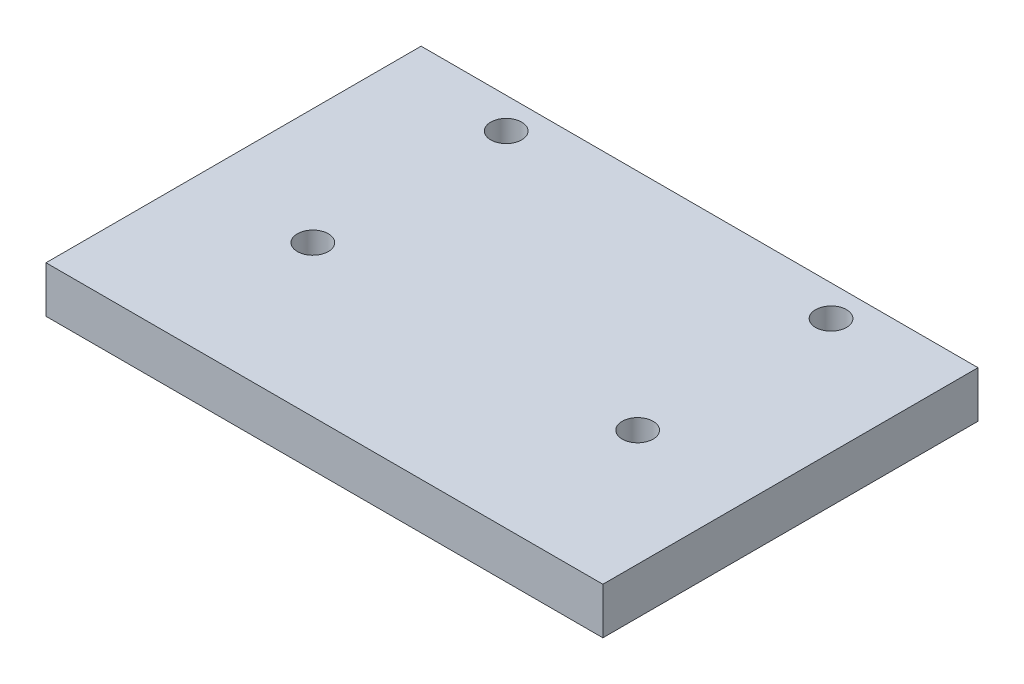
ISO-10303-21;
HEADER;
FILE_DESCRIPTION(('STEP AP214'),'2;1');
FILE_NAME('part.step','',(''),(''),'','','');
FILE_SCHEMA(('AUTOMOTIVE_DESIGN { 1 0 10303 214 1 1 1 1 }'));
ENDSEC;
DATA;
#1=APPLICATION_CONTEXT('core data for automotive mechanical design processes');
#2=APPLICATION_PROTOCOL_DEFINITION('international standard','automotive_design',2000,#1);
#3=PRODUCT_CONTEXT('',#1,'mechanical');
#4=PRODUCT('Part','Part','',(#3));
#5=PRODUCT_RELATED_PRODUCT_CATEGORY('part','',(#4));
#6=PRODUCT_DEFINITION_FORMATION('','',#4);
#7=PRODUCT_DEFINITION_CONTEXT('part definition',#1,'design');
#8=PRODUCT_DEFINITION('design','',#6,#7);
#9=PRODUCT_DEFINITION_SHAPE('','',#8);
#10=(LENGTH_UNIT() NAMED_UNIT(*) SI_UNIT(.MILLI.,.METRE.));
#11=(NAMED_UNIT(*) PLANE_ANGLE_UNIT() SI_UNIT($,.RADIAN.));
#12=(NAMED_UNIT(*) SI_UNIT($,.STERADIAN.) SOLID_ANGLE_UNIT());
#13=UNCERTAINTY_MEASURE_WITH_UNIT(LENGTH_MEASURE(1.E-05),#10,'distance_accuracy_value','');
#14=(GEOMETRIC_REPRESENTATION_CONTEXT(3) GLOBAL_UNCERTAINTY_ASSIGNED_CONTEXT((#13)) GLOBAL_UNIT_ASSIGNED_CONTEXT((#10,
#11,#12)) REPRESENTATION_CONTEXT('',''));
#15=CARTESIAN_POINT('',(0.,0.,0.));
#16=DIRECTION('',(0.,0.,1.));
#17=DIRECTION('',(1.,0.,0.));
#18=AXIS2_PLACEMENT_3D('',#15,#16,#17);
#19=CARTESIAN_POINT('',(0.,3.,0.));
#20=DIRECTION('',(0.,-1.,0.));
#21=DIRECTION('',(0.,0.,-1.));
#22=AXIS2_PLACEMENT_3D('',#19,#20,#21);
#23=PLANE('',#22);
#24=DIRECTION('',(1.,0.,0.));
#25=VECTOR('',#24,1.);
#26=CARTESIAN_POINT('',(36.,3.,0.));
#27=LINE('',#26,#25);
#28=CARTESIAN_POINT('',(0.,3.,0.));
#29=VERTEX_POINT('',#28);
#30=CARTESIAN_POINT('',(36.,3.,0.));
#31=VERTEX_POINT('',#30);
#32=EDGE_CURVE('E85',#29,#31,#27,.T.);
#33=ORIENTED_EDGE('',*,*,#32,.T.);
#34=DIRECTION('',(0.,0.,-1.));
#35=VECTOR('',#34,1.);
#36=CARTESIAN_POINT('',(36.,3.,-24.25));
#37=LINE('',#36,#35);
#38=CARTESIAN_POINT('',(36.,3.,-24.25));
#39=VERTEX_POINT('',#38);
#40=EDGE_CURVE('E80',#31,#39,#37,.T.);
#41=ORIENTED_EDGE('',*,*,#40,.T.);
#42=DIRECTION('',(-1.,0.,0.));
#43=VECTOR('',#42,1.);
#44=CARTESIAN_POINT('',(0.,3.,-24.25));
#45=LINE('',#44,#43);
#46=CARTESIAN_POINT('',(0.,3.,-24.25));
#47=VERTEX_POINT('',#46);
#48=EDGE_CURVE('E83',#39,#47,#45,.T.);
#49=ORIENTED_EDGE('',*,*,#48,.T.);
#50=DIRECTION('',(0.,0.,1.));
#51=VECTOR('',#50,1.);
#52=CARTESIAN_POINT('',(0.,3.,0.));
#53=LINE('',#52,#51);
#54=EDGE_CURVE('E50',#47,#29,#53,.T.);
#55=ORIENTED_EDGE('',*,*,#54,.T.);
#56=EDGE_LOOP('',(#33,#41,#49,#55));
#57=FACE_BOUND('',#56,.T.);
#58=CARTESIAN_POINT('',(7.5,3.,-22.25));
#59=DIRECTION('',(0.,1.,0.));
#60=DIRECTION('',(0.,0.,1.));
#61=AXIS2_PLACEMENT_3D('',#58,#59,#60);
#62=CIRCLE('',#61,1.);
#63=CARTESIAN_POINT('',(7.5,3.,-21.25));
#64=VERTEX_POINT('',#63);
#65=EDGE_CURVE('E100',#64,#64,#62,.T.);
#66=ORIENTED_EDGE('',*,*,#65,.F.);
#67=EDGE_LOOP('',(#66));
#68=FACE_BOUND('',#67,.T.);
#69=CARTESIAN_POINT('',(28.5,3.,-22.25));
#70=DIRECTION('',(0.,1.,0.));
#71=DIRECTION('',(0.,0.,1.));
#72=AXIS2_PLACEMENT_3D('',#69,#70,#71);
#73=CIRCLE('',#72,1.);
#74=CARTESIAN_POINT('',(28.5,3.,-21.25));
#75=VERTEX_POINT('',#74);
#76=EDGE_CURVE('E115',#75,#75,#73,.T.);
#77=ORIENTED_EDGE('',*,*,#76,.F.);
#78=EDGE_LOOP('',(#77));
#79=FACE_BOUND('',#78,.T.);
#80=CARTESIAN_POINT('',(28.5,3.,-9.75));
#81=DIRECTION('',(0.,1.,0.));
#82=DIRECTION('',(0.,0.,1.));
#83=AXIS2_PLACEMENT_3D('',#80,#81,#82);
#84=CIRCLE('',#83,1.);
#85=CARTESIAN_POINT('',(28.5,3.,-8.75));
#86=VERTEX_POINT('',#85);
#87=EDGE_CURVE('E121',#86,#86,#84,.T.);
#88=ORIENTED_EDGE('',*,*,#87,.F.);
#89=EDGE_LOOP('',(#88));
#90=FACE_BOUND('',#89,.T.);
#91=CARTESIAN_POINT('',(7.5,3.,-9.75));
#92=DIRECTION('',(0.,1.,0.));
#93=DIRECTION('',(0.,0.,1.));
#94=AXIS2_PLACEMENT_3D('',#91,#92,#93);
#95=CIRCLE('',#94,1.);
#96=CARTESIAN_POINT('',(7.5,3.,-8.75));
#97=VERTEX_POINT('',#96);
#98=EDGE_CURVE('E127',#97,#97,#95,.T.);
#99=ORIENTED_EDGE('',*,*,#98,.F.);
#100=EDGE_LOOP('',(#99));
#101=FACE_BOUND('',#100,.T.);
#102=ADVANCED_FACE('F33',(#57,#68,#79,#90,#101),#23,.F.);
#103=CARTESIAN_POINT('',(0.,0.,0.));
#104=DIRECTION('',(0.,-1.,0.));
#105=DIRECTION('',(0.,0.,-1.));
#106=AXIS2_PLACEMENT_3D('',#103,#104,#105);
#107=PLANE('',#106);
#108=CARTESIAN_POINT('',(28.5,0.,-9.75));
#109=DIRECTION('',(0.,1.,0.));
#110=DIRECTION('',(0.,0.,1.));
#111=AXIS2_PLACEMENT_3D('',#108,#109,#110);
#112=CIRCLE('',#111,1.);
#113=CARTESIAN_POINT('',(28.5,0.,-8.75));
#114=VERTEX_POINT('',#113);
#115=EDGE_CURVE('E124',#114,#114,#112,.T.);
#116=ORIENTED_EDGE('',*,*,#115,.T.);
#117=EDGE_LOOP('',(#116));
#118=FACE_BOUND('',#117,.T.);
#119=CARTESIAN_POINT('',(7.5,0.,-22.25));
#120=DIRECTION('',(0.,1.,0.));
#121=DIRECTION('',(0.,0.,1.));
#122=AXIS2_PLACEMENT_3D('',#119,#120,#121);
#123=CIRCLE('',#122,1.);
#124=CARTESIAN_POINT('',(7.5,0.,-21.25));
#125=VERTEX_POINT('',#124);
#126=EDGE_CURVE('E112',#125,#125,#123,.T.);
#127=ORIENTED_EDGE('',*,*,#126,.T.);
#128=EDGE_LOOP('',(#127));
#129=FACE_BOUND('',#128,.T.);
#130=DIRECTION('',(1.,0.,0.));
#131=VECTOR('',#130,1.);
#132=CARTESIAN_POINT('',(36.,0.,0.));
#133=LINE('',#132,#131);
#134=CARTESIAN_POINT('',(0.,0.,0.));
#135=VERTEX_POINT('',#134);
#136=CARTESIAN_POINT('',(36.,0.,0.));
#137=VERTEX_POINT('',#136);
#138=EDGE_CURVE('E97',#135,#137,#133,.T.);
#139=ORIENTED_EDGE('',*,*,#138,.F.);
#140=DIRECTION('',(0.,0.,1.));
#141=VECTOR('',#140,1.);
#142=CARTESIAN_POINT('',(0.,0.,0.));
#143=LINE('',#142,#141);
#144=CARTESIAN_POINT('',(0.,0.,-24.25));
#145=VERTEX_POINT('',#144);
#146=EDGE_CURVE('E73',#145,#135,#143,.T.);
#147=ORIENTED_EDGE('',*,*,#146,.F.);
#148=DIRECTION('',(-1.,0.,0.));
#149=VECTOR('',#148,1.);
#150=CARTESIAN_POINT('',(0.,0.,-24.25));
#151=LINE('',#150,#149);
#152=CARTESIAN_POINT('',(36.,0.,-24.25));
#153=VERTEX_POINT('',#152);
#154=EDGE_CURVE('E67',#153,#145,#151,.T.);
#155=ORIENTED_EDGE('',*,*,#154,.F.);
#156=DIRECTION('',(0.,0.,-1.));
#157=VECTOR('',#156,1.);
#158=CARTESIAN_POINT('',(36.,0.,-24.25));
#159=LINE('',#158,#157);
#160=EDGE_CURVE('E89',#137,#153,#159,.T.);
#161=ORIENTED_EDGE('',*,*,#160,.F.);
#162=EDGE_LOOP('',(#139,#147,#155,#161));
#163=FACE_BOUND('',#162,.T.);
#164=CARTESIAN_POINT('',(28.5,0.,-22.25));
#165=DIRECTION('',(0.,1.,0.));
#166=DIRECTION('',(0.,0.,1.));
#167=AXIS2_PLACEMENT_3D('',#164,#165,#166);
#168=CIRCLE('',#167,1.);
#169=CARTESIAN_POINT('',(28.5,0.,-21.25));
#170=VERTEX_POINT('',#169);
#171=EDGE_CURVE('E118',#170,#170,#168,.T.);
#172=ORIENTED_EDGE('',*,*,#171,.T.);
#173=EDGE_LOOP('',(#172));
#174=FACE_BOUND('',#173,.T.);
#175=CARTESIAN_POINT('',(7.5,0.,-9.75));
#176=DIRECTION('',(0.,1.,0.));
#177=DIRECTION('',(0.,0.,1.));
#178=AXIS2_PLACEMENT_3D('',#175,#176,#177);
#179=CIRCLE('',#178,1.);
#180=CARTESIAN_POINT('',(7.5,0.,-8.75));
#181=VERTEX_POINT('',#180);
#182=EDGE_CURVE('E130',#181,#181,#179,.T.);
#183=ORIENTED_EDGE('',*,*,#182,.T.);
#184=EDGE_LOOP('',(#183));
#185=FACE_BOUND('',#184,.T.);
#186=ADVANCED_FACE('F108',(#118,#129,#163,#174,#185),#107,.T.);
#187=CARTESIAN_POINT('',(36.,3.,0.));
#188=DIRECTION('',(0.,0.,-1.));
#189=DIRECTION('',(-1.,0.,0.));
#190=AXIS2_PLACEMENT_3D('',#187,#188,#189);
#191=PLANE('',#190);
#192=ORIENTED_EDGE('',*,*,#138,.T.);
#193=DIRECTION('',(0.,-1.,0.));
#194=VECTOR('',#193,1.);
#195=CARTESIAN_POINT('',(36.,3.,0.));
#196=LINE('',#195,#194);
#197=EDGE_CURVE('E11',#31,#137,#196,.T.);
#198=ORIENTED_EDGE('',*,*,#197,.F.);
#199=ORIENTED_EDGE('',*,*,#32,.F.);
#200=DIRECTION('',(0.,-1.,0.));
#201=VECTOR('',#200,1.);
#202=CARTESIAN_POINT('',(0.,3.,0.));
#203=LINE('',#202,#201);
#204=EDGE_CURVE('E93',#29,#135,#203,.T.);
#205=ORIENTED_EDGE('',*,*,#204,.T.);
#206=EDGE_LOOP('',(#192,#198,#199,#205));
#207=FACE_BOUND('',#206,.T.);
#208=ADVANCED_FACE('F35',(#207),#191,.F.);
#209=CARTESIAN_POINT('',(36.,3.,-24.25));
#210=DIRECTION('',(-1.,0.,0.));
#211=DIRECTION('',(0.,0.,1.));
#212=AXIS2_PLACEMENT_3D('',#209,#210,#211);
#213=PLANE('',#212);
#214=ORIENTED_EDGE('',*,*,#160,.T.);
#215=DIRECTION('',(0.,-1.,0.));
#216=VECTOR('',#215,1.);
#217=CARTESIAN_POINT('',(36.,3.,-24.25));
#218=LINE('',#217,#216);
#219=EDGE_CURVE('E42',#39,#153,#218,.T.);
#220=ORIENTED_EDGE('',*,*,#219,.F.);
#221=ORIENTED_EDGE('',*,*,#40,.F.);
#222=ORIENTED_EDGE('',*,*,#197,.T.);
#223=EDGE_LOOP('',(#214,#220,#221,#222));
#224=FACE_BOUND('',#223,.T.);
#225=ADVANCED_FACE('F88',(#224),#213,.F.);
#226=CARTESIAN_POINT('',(0.,3.,-24.25));
#227=DIRECTION('',(0.,0.,1.));
#228=DIRECTION('',(1.,0.,0.));
#229=AXIS2_PLACEMENT_3D('',#226,#227,#228);
#230=PLANE('',#229);
#231=ORIENTED_EDGE('',*,*,#154,.T.);
#232=DIRECTION('',(0.,-1.,0.));
#233=VECTOR('',#232,1.);
#234=CARTESIAN_POINT('',(0.,3.,-24.25));
#235=LINE('',#234,#233);
#236=EDGE_CURVE('E90',#47,#145,#235,.T.);
#237=ORIENTED_EDGE('',*,*,#236,.F.);
#238=ORIENTED_EDGE('',*,*,#48,.F.);
#239=ORIENTED_EDGE('',*,*,#219,.T.);
#240=EDGE_LOOP('',(#231,#237,#238,#239));
#241=FACE_BOUND('',#240,.T.);
#242=ADVANCED_FACE('F91',(#241),#230,.F.);
#243=CARTESIAN_POINT('',(0.,3.,0.));
#244=DIRECTION('',(1.,0.,0.));
#245=DIRECTION('',(0.,0.,-1.));
#246=AXIS2_PLACEMENT_3D('',#243,#244,#245);
#247=PLANE('',#246);
#248=ORIENTED_EDGE('',*,*,#146,.T.);
#249=ORIENTED_EDGE('',*,*,#204,.F.);
#250=ORIENTED_EDGE('',*,*,#54,.F.);
#251=ORIENTED_EDGE('',*,*,#236,.T.);
#252=EDGE_LOOP('',(#248,#249,#250,#251));
#253=FACE_BOUND('',#252,.T.);
#254=ADVANCED_FACE('F105',(#253),#247,.F.);
#255=CARTESIAN_POINT('',(7.5,3.,-22.25));
#256=DIRECTION('',(0.,-1.,0.));
#257=DIRECTION('',(0.,0.,-1.));
#258=AXIS2_PLACEMENT_3D('',#255,#256,#257);
#259=CYLINDRICAL_SURFACE('',#258,1.);
#260=ORIENTED_EDGE('',*,*,#65,.T.);
#261=EDGE_LOOP('',(#260));
#262=FACE_BOUND('',#261,.T.);
#263=ORIENTED_EDGE('',*,*,#126,.F.);
#264=EDGE_LOOP('',(#263));
#265=FACE_BOUND('',#264,.T.);
#266=ADVANCED_FACE('F147',(#262,#265),#259,.F.);
#267=CARTESIAN_POINT('',(28.5,3.,-22.25));
#268=DIRECTION('',(0.,-1.,0.));
#269=DIRECTION('',(0.,0.,-1.));
#270=AXIS2_PLACEMENT_3D('',#267,#268,#269);
#271=CYLINDRICAL_SURFACE('',#270,1.);
#272=ORIENTED_EDGE('',*,*,#76,.T.);
#273=EDGE_LOOP('',(#272));
#274=FACE_BOUND('',#273,.T.);
#275=ORIENTED_EDGE('',*,*,#171,.F.);
#276=EDGE_LOOP('',(#275));
#277=FACE_BOUND('',#276,.T.);
#278=ADVANCED_FACE('F193',(#274,#277),#271,.F.);
#279=CARTESIAN_POINT('',(28.5,3.,-9.75));
#280=DIRECTION('',(0.,-1.,0.));
#281=DIRECTION('',(0.,0.,-1.));
#282=AXIS2_PLACEMENT_3D('',#279,#280,#281);
#283=CYLINDRICAL_SURFACE('',#282,1.);
#284=ORIENTED_EDGE('',*,*,#87,.T.);
#285=EDGE_LOOP('',(#284));
#286=FACE_BOUND('',#285,.T.);
#287=ORIENTED_EDGE('',*,*,#115,.F.);
#288=EDGE_LOOP('',(#287));
#289=FACE_BOUND('',#288,.T.);
#290=ADVANCED_FACE('F201',(#286,#289),#283,.F.);
#291=CARTESIAN_POINT('',(7.5,3.,-9.75));
#292=DIRECTION('',(0.,-1.,0.));
#293=DIRECTION('',(0.,0.,-1.));
#294=AXIS2_PLACEMENT_3D('',#291,#292,#293);
#295=CYLINDRICAL_SURFACE('',#294,1.);
#296=ORIENTED_EDGE('',*,*,#98,.T.);
#297=EDGE_LOOP('',(#296));
#298=FACE_BOUND('',#297,.T.);
#299=ORIENTED_EDGE('',*,*,#182,.F.);
#300=EDGE_LOOP('',(#299));
#301=FACE_BOUND('',#300,.T.);
#302=ADVANCED_FACE('F136',(#298,#301),#295,.F.);
#303=CLOSED_SHELL('',(#102,#186,#208,#225,#242,#254,#266,#278,#290,#302));
#304=MANIFOLD_SOLID_BREP('B2',#303);
#305=ADVANCED_BREP_SHAPE_REPRESENTATION('',(#18,#304),#14);
#306=SHAPE_DEFINITION_REPRESENTATION(#9,#305);
ENDSEC;
END-ISO-10303-21;
